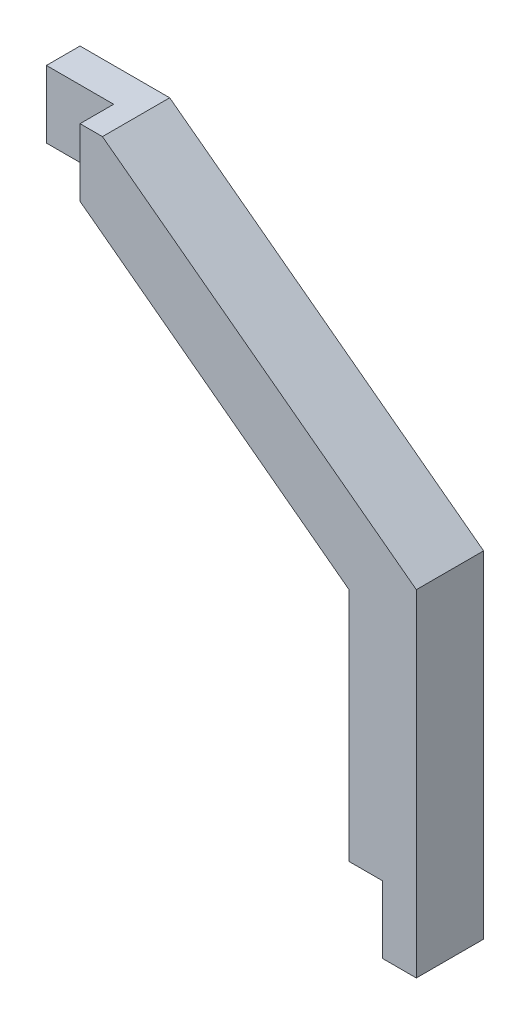
ISO-10303-21;
HEADER;
FILE_DESCRIPTION(('STEP AP214'),'2;1');
FILE_NAME('part.step','',(''),(''),'','','');
FILE_SCHEMA(('AUTOMOTIVE_DESIGN { 1 0 10303 214 1 1 1 1 }'));
ENDSEC;
DATA;
#1=APPLICATION_CONTEXT('core data for automotive mechanical design processes');
#2=APPLICATION_PROTOCOL_DEFINITION('international standard','automotive_design',2000,#1);
#3=PRODUCT_CONTEXT('',#1,'mechanical');
#4=PRODUCT('Part','Part','',(#3));
#5=PRODUCT_RELATED_PRODUCT_CATEGORY('part','',(#4));
#6=PRODUCT_DEFINITION_FORMATION('','',#4);
#7=PRODUCT_DEFINITION_CONTEXT('part definition',#1,'design');
#8=PRODUCT_DEFINITION('design','',#6,#7);
#9=PRODUCT_DEFINITION_SHAPE('','',#8);
#10=(LENGTH_UNIT() NAMED_UNIT(*) SI_UNIT(.MILLI.,.METRE.));
#11=(NAMED_UNIT(*) PLANE_ANGLE_UNIT() SI_UNIT($,.RADIAN.));
#12=(NAMED_UNIT(*) SI_UNIT($,.STERADIAN.) SOLID_ANGLE_UNIT());
#13=UNCERTAINTY_MEASURE_WITH_UNIT(LENGTH_MEASURE(1.E-05),#10,'distance_accuracy_value','');
#14=(GEOMETRIC_REPRESENTATION_CONTEXT(3) GLOBAL_UNCERTAINTY_ASSIGNED_CONTEXT((#13)) GLOBAL_UNIT_ASSIGNED_CONTEXT((#10,
#11,#12)) REPRESENTATION_CONTEXT('',''));
#15=CARTESIAN_POINT('',(0.,0.,0.));
#16=DIRECTION('',(0.,0.,1.));
#17=DIRECTION('',(1.,0.,0.));
#18=AXIS2_PLACEMENT_3D('',#15,#16,#17);
#19=CARTESIAN_POINT('',(40.,-170.,20.));
#20=DIRECTION('',(-1.,0.,0.));
#21=DIRECTION('',(0.,-1.,0.));
#22=AXIS2_PLACEMENT_3D('',#19,#20,#21);
#23=PLANE('',#22);
#24=DIRECTION('',(0.,1.,0.));
#25=VECTOR('',#24,1.);
#26=CARTESIAN_POINT('',(40.,-170.,0.));
#27=LINE('',#26,#25);
#28=CARTESIAN_POINT('',(40.,-150.,0.));
#29=VERTEX_POINT('',#28);
#30=CARTESIAN_POINT('',(40.,-80.,0.));
#31=VERTEX_POINT('',#30);
#32=EDGE_CURVE('E162',#29,#31,#27,.T.);
#33=ORIENTED_EDGE('',*,*,#32,.F.);
#34=DIRECTION('',(0.,0.,1.));
#35=VECTOR('',#34,1.);
#36=CARTESIAN_POINT('',(40.,-150.,0.));
#37=LINE('',#36,#35);
#38=CARTESIAN_POINT('',(40.,-150.,20.));
#39=VERTEX_POINT('',#38);
#40=EDGE_CURVE('E222',#29,#39,#37,.T.);
#41=ORIENTED_EDGE('',*,*,#40,.T.);
#42=DIRECTION('',(0.,1.,0.));
#43=VECTOR('',#42,1.);
#44=CARTESIAN_POINT('',(40.,-170.,20.));
#45=LINE('',#44,#43);
#46=CARTESIAN_POINT('',(40.,-80.,20.));
#47=VERTEX_POINT('',#46);
#48=EDGE_CURVE('E137',#39,#47,#45,.T.);
#49=ORIENTED_EDGE('',*,*,#48,.T.);
#50=DIRECTION('',(0.,0.,-1.));
#51=VECTOR('',#50,1.);
#52=CARTESIAN_POINT('',(40.,-80.,20.));
#53=LINE('',#52,#51);
#54=EDGE_CURVE('E125',#47,#31,#53,.T.);
#55=ORIENTED_EDGE('',*,*,#54,.T.);
#56=EDGE_LOOP('',(#33,#41,#49,#55));
#57=FACE_BOUND('',#56,.T.);
#58=ADVANCED_FACE('F39',(#57),#23,.T.);
#59=CARTESIAN_POINT('',(0.,0.,20.));
#60=DIRECTION('',(0.,0.,-1.));
#61=DIRECTION('',(-1.,0.,0.));
#62=AXIS2_PLACEMENT_3D('',#59,#60,#61);
#63=PLANE('',#62);
#64=DIRECTION('',(-1.,0.,0.));
#65=VECTOR('',#64,1.);
#66=CARTESIAN_POINT('',(50.,-150.,20.));
#67=LINE('',#66,#65);
#68=CARTESIAN_POINT('',(50.,-150.,20.));
#69=VERTEX_POINT('',#68);
#70=EDGE_CURVE('E208',#69,#39,#67,.T.);
#71=ORIENTED_EDGE('',*,*,#70,.F.);
#72=DIRECTION('',(0.,-1.,0.));
#73=VECTOR('',#72,1.);
#74=CARTESIAN_POINT('',(50.,-150.,20.));
#75=LINE('',#74,#73);
#76=CARTESIAN_POINT('',(50.,-170.,20.));
#77=VERTEX_POINT('',#76);
#78=EDGE_CURVE('E136',#69,#77,#75,.T.);
#79=ORIENTED_EDGE('',*,*,#78,.T.);
#80=DIRECTION('',(-1.,0.,0.));
#81=VECTOR('',#80,1.);
#82=CARTESIAN_POINT('',(60.,-170.,20.));
#83=LINE('',#82,#81);
#84=CARTESIAN_POINT('',(60.,-170.,20.));
#85=VERTEX_POINT('',#84);
#86=EDGE_CURVE('E118',#85,#77,#83,.T.);
#87=ORIENTED_EDGE('',*,*,#86,.F.);
#88=DIRECTION('',(0.,-1.,0.));
#89=VECTOR('',#88,1.);
#90=CARTESIAN_POINT('',(60.,-69.9999999999999,20.));
#91=LINE('',#90,#89);
#92=CARTESIAN_POINT('',(60.,-69.9999999999999,20.));
#93=VERTEX_POINT('',#92);
#94=EDGE_CURVE('E134',#93,#85,#91,.T.);
#95=ORIENTED_EDGE('',*,*,#94,.F.);
#96=DIRECTION('',(0.8,-0.6,0.));
#97=VECTOR('',#96,1.);
#98=CARTESIAN_POINT('',(-33.3333333333333,0.,20.));
#99=LINE('',#98,#97);
#100=CARTESIAN_POINT('',(-33.3333333333333,0.,20.));
#101=VERTEX_POINT('',#100);
#102=EDGE_CURVE('E140',#101,#93,#99,.T.);
#103=ORIENTED_EDGE('',*,*,#102,.F.);
#104=DIRECTION('',(1.,0.,0.));
#105=VECTOR('',#104,1.);
#106=CARTESIAN_POINT('',(-60.,0.,20.));
#107=LINE('',#106,#105);
#108=CARTESIAN_POINT('',(-40.,0.,20.));
#109=VERTEX_POINT('',#108);
#110=EDGE_CURVE('E102',#109,#101,#107,.T.);
#111=ORIENTED_EDGE('',*,*,#110,.F.);
#112=DIRECTION('',(0.,1.,0.));
#113=VECTOR('',#112,1.);
#114=CARTESIAN_POINT('',(-40.,-20.,20.));
#115=LINE('',#114,#113);
#116=CARTESIAN_POINT('',(-40.,-20.,20.));
#117=VERTEX_POINT('',#116);
#118=EDGE_CURVE('E202',#117,#109,#115,.T.);
#119=ORIENTED_EDGE('',*,*,#118,.F.);
#120=DIRECTION('',(-0.8,0.6,0.));
#121=VECTOR('',#120,1.);
#122=CARTESIAN_POINT('',(40.,-80.,20.));
#123=LINE('',#122,#121);
#124=EDGE_CURVE('E146',#47,#117,#123,.T.);
#125=ORIENTED_EDGE('',*,*,#124,.F.);
#126=ORIENTED_EDGE('',*,*,#48,.F.);
#127=EDGE_LOOP('',(#71,#79,#87,#95,#103,#111,#119,#125,#126));
#128=FACE_BOUND('',#127,.T.);
#129=ADVANCED_FACE('F132',(#128),#63,.F.);
#130=CARTESIAN_POINT('',(0.,0.,0.));
#131=DIRECTION('',(0.,0.,-1.));
#132=DIRECTION('',(-1.,0.,0.));
#133=AXIS2_PLACEMENT_3D('',#130,#131,#132);
#134=PLANE('',#133);
#135=DIRECTION('',(0.,1.,0.));
#136=VECTOR('',#135,1.);
#137=CARTESIAN_POINT('',(50.,-170.,0.));
#138=LINE('',#137,#136);
#139=CARTESIAN_POINT('',(50.,-170.,0.));
#140=VERTEX_POINT('',#139);
#141=CARTESIAN_POINT('',(50.,-150.,0.));
#142=VERTEX_POINT('',#141);
#143=EDGE_CURVE('E226',#140,#142,#138,.T.);
#144=ORIENTED_EDGE('',*,*,#143,.T.);
#145=DIRECTION('',(-1.,0.,0.));
#146=VECTOR('',#145,1.);
#147=CARTESIAN_POINT('',(50.,-150.,0.));
#148=LINE('',#147,#146);
#149=EDGE_CURVE('E204',#142,#29,#148,.T.);
#150=ORIENTED_EDGE('',*,*,#149,.T.);
#151=ORIENTED_EDGE('',*,*,#32,.T.);
#152=DIRECTION('',(-0.8,0.6,0.));
#153=VECTOR('',#152,1.);
#154=CARTESIAN_POINT('',(40.,-80.,0.));
#155=LINE('',#154,#153);
#156=CARTESIAN_POINT('',(-40.,-20.,0.));
#157=VERTEX_POINT('',#156);
#158=EDGE_CURVE('E164',#31,#157,#155,.T.);
#159=ORIENTED_EDGE('',*,*,#158,.T.);
#160=DIRECTION('',(-1.,0.,0.));
#161=VECTOR('',#160,1.);
#162=CARTESIAN_POINT('',(-40.,-20.,0.));
#163=LINE('',#162,#161);
#164=CARTESIAN_POINT('',(-60.,-20.,0.));
#165=VERTEX_POINT('',#164);
#166=EDGE_CURVE('E167',#157,#165,#163,.T.);
#167=ORIENTED_EDGE('',*,*,#166,.T.);
#168=DIRECTION('',(0.,1.,0.));
#169=VECTOR('',#168,1.);
#170=CARTESIAN_POINT('',(-60.,-20.,0.));
#171=LINE('',#170,#169);
#172=CARTESIAN_POINT('',(-60.,0.,0.));
#173=VERTEX_POINT('',#172);
#174=EDGE_CURVE('E149',#165,#173,#171,.T.);
#175=ORIENTED_EDGE('',*,*,#174,.T.);
#176=DIRECTION('',(1.,0.,0.));
#177=VECTOR('',#176,1.);
#178=CARTESIAN_POINT('',(-60.,0.,0.));
#179=LINE('',#178,#177);
#180=CARTESIAN_POINT('',(-33.3333333333333,0.,0.));
#181=VERTEX_POINT('',#180);
#182=EDGE_CURVE('E152',#173,#181,#179,.T.);
#183=ORIENTED_EDGE('',*,*,#182,.T.);
#184=DIRECTION('',(0.8,-0.6,0.));
#185=VECTOR('',#184,1.);
#186=CARTESIAN_POINT('',(-33.3333333333333,0.,0.));
#187=LINE('',#186,#185);
#188=CARTESIAN_POINT('',(60.,-69.9999999999999,0.));
#189=VERTEX_POINT('',#188);
#190=EDGE_CURVE('E156',#181,#189,#187,.T.);
#191=ORIENTED_EDGE('',*,*,#190,.T.);
#192=DIRECTION('',(0.,-1.,0.));
#193=VECTOR('',#192,1.);
#194=CARTESIAN_POINT('',(60.,-69.9999999999999,0.));
#195=LINE('',#194,#193);
#196=CARTESIAN_POINT('',(60.,-170.,0.));
#197=VERTEX_POINT('',#196);
#198=EDGE_CURVE('E159',#189,#197,#195,.T.);
#199=ORIENTED_EDGE('',*,*,#198,.T.);
#200=DIRECTION('',(-1.,0.,0.));
#201=VECTOR('',#200,1.);
#202=CARTESIAN_POINT('',(60.,-170.,0.));
#203=LINE('',#202,#201);
#204=EDGE_CURVE('E120',#197,#140,#203,.T.);
#205=ORIENTED_EDGE('',*,*,#204,.T.);
#206=EDGE_LOOP('',(#144,#150,#151,#159,#167,#175,#183,#191,#199,#205));
#207=FACE_BOUND('',#206,.T.);
#208=ADVANCED_FACE('F186',(#207),#134,.T.);
#209=CARTESIAN_POINT('',(-60.,-20.,20.));
#210=DIRECTION('',(-1.,0.,0.));
#211=DIRECTION('',(0.,0.,1.));
#212=AXIS2_PLACEMENT_3D('',#209,#210,#211);
#213=PLANE('',#212);
#214=DIRECTION('',(0.,0.,-1.));
#215=VECTOR('',#214,1.);
#216=CARTESIAN_POINT('',(-60.,-20.,20.));
#217=LINE('',#216,#215);
#218=CARTESIAN_POINT('',(-60.,-20.,10.));
#219=VERTEX_POINT('',#218);
#220=EDGE_CURVE('E11',#219,#165,#217,.T.);
#221=ORIENTED_EDGE('',*,*,#220,.F.);
#222=DIRECTION('',(0.,-1.,0.));
#223=VECTOR('',#222,1.);
#224=CARTESIAN_POINT('',(-60.,0.,10.));
#225=LINE('',#224,#223);
#226=CARTESIAN_POINT('',(-60.,0.,10.));
#227=VERTEX_POINT('',#226);
#228=EDGE_CURVE('E181',#227,#219,#225,.T.);
#229=ORIENTED_EDGE('',*,*,#228,.F.);
#230=DIRECTION('',(0.,0.,-1.));
#231=VECTOR('',#230,1.);
#232=CARTESIAN_POINT('',(-60.,0.,20.));
#233=LINE('',#232,#231);
#234=EDGE_CURVE('E43',#227,#173,#233,.T.);
#235=ORIENTED_EDGE('',*,*,#234,.T.);
#236=ORIENTED_EDGE('',*,*,#174,.F.);
#237=EDGE_LOOP('',(#221,#229,#235,#236));
#238=FACE_BOUND('',#237,.T.);
#239=ADVANCED_FACE('F41',(#238),#213,.T.);
#240=CARTESIAN_POINT('',(-40.,-20.,20.));
#241=DIRECTION('',(0.,-1.,0.));
#242=DIRECTION('',(1.,0.,0.));
#243=AXIS2_PLACEMENT_3D('',#240,#241,#242);
#244=PLANE('',#243);
#245=DIRECTION('',(0.,0.,-1.));
#246=VECTOR('',#245,1.);
#247=CARTESIAN_POINT('',(-40.,-20.,20.));
#248=LINE('',#247,#246);
#249=CARTESIAN_POINT('',(-40.,-20.,10.));
#250=VERTEX_POINT('',#249);
#251=EDGE_CURVE('E171',#250,#157,#248,.T.);
#252=ORIENTED_EDGE('',*,*,#251,.F.);
#253=DIRECTION('',(1.,0.,0.));
#254=VECTOR('',#253,1.);
#255=CARTESIAN_POINT('',(-60.,-20.,10.));
#256=LINE('',#255,#254);
#257=EDGE_CURVE('E193',#219,#250,#256,.T.);
#258=ORIENTED_EDGE('',*,*,#257,.F.);
#259=ORIENTED_EDGE('',*,*,#220,.T.);
#260=ORIENTED_EDGE('',*,*,#166,.F.);
#261=EDGE_LOOP('',(#252,#258,#259,#260));
#262=FACE_BOUND('',#261,.T.);
#263=ADVANCED_FACE('F189',(#262),#244,.T.);
#264=CARTESIAN_POINT('',(40.,-80.,20.));
#265=DIRECTION('',(-0.6,-0.8,0.));
#266=DIRECTION('',(0.8,-0.6,0.));
#267=AXIS2_PLACEMENT_3D('',#264,#265,#266);
#268=PLANE('',#267);
#269=ORIENTED_EDGE('',*,*,#158,.F.);
#270=ORIENTED_EDGE('',*,*,#54,.F.);
#271=ORIENTED_EDGE('',*,*,#124,.T.);
#272=EDGE_CURVE('E48',#117,#250,#248,.T.);
#273=ORIENTED_EDGE('',*,*,#272,.T.);
#274=ORIENTED_EDGE('',*,*,#251,.T.);
#275=EDGE_LOOP('',(#269,#270,#271,#273,#274));
#276=FACE_BOUND('',#275,.T.);
#277=ADVANCED_FACE('F197',(#276),#268,.T.);
#278=CARTESIAN_POINT('',(60.,-170.,20.));
#279=DIRECTION('',(0.,-1.,0.));
#280=DIRECTION('',(0.,0.,-1.));
#281=AXIS2_PLACEMENT_3D('',#278,#279,#280);
#282=PLANE('',#281);
#283=DIRECTION('',(0.,0.,-1.));
#284=VECTOR('',#283,1.);
#285=CARTESIAN_POINT('',(50.,-170.,20.));
#286=LINE('',#285,#284);
#287=EDGE_CURVE('E228',#77,#140,#286,.T.);
#288=ORIENTED_EDGE('',*,*,#287,.T.);
#289=ORIENTED_EDGE('',*,*,#204,.F.);
#290=DIRECTION('',(0.,0.,-1.));
#291=VECTOR('',#290,1.);
#292=CARTESIAN_POINT('',(60.,-170.,20.));
#293=LINE('',#292,#291);
#294=EDGE_CURVE('E113',#85,#197,#293,.T.);
#295=ORIENTED_EDGE('',*,*,#294,.F.);
#296=ORIENTED_EDGE('',*,*,#86,.T.);
#297=EDGE_LOOP('',(#288,#289,#295,#296));
#298=FACE_BOUND('',#297,.T.);
#299=ADVANCED_FACE('F116',(#298),#282,.T.);
#300=CARTESIAN_POINT('',(60.,-69.9999999999999,20.));
#301=DIRECTION('',(1.,0.,0.));
#302=DIRECTION('',(0.,1.,0.));
#303=AXIS2_PLACEMENT_3D('',#300,#301,#302);
#304=PLANE('',#303);
#305=ORIENTED_EDGE('',*,*,#198,.F.);
#306=DIRECTION('',(0.,0.,-1.));
#307=VECTOR('',#306,1.);
#308=CARTESIAN_POINT('',(60.,-69.9999999999999,20.));
#309=LINE('',#308,#307);
#310=EDGE_CURVE('E126',#93,#189,#309,.T.);
#311=ORIENTED_EDGE('',*,*,#310,.F.);
#312=ORIENTED_EDGE('',*,*,#94,.T.);
#313=ORIENTED_EDGE('',*,*,#294,.T.);
#314=EDGE_LOOP('',(#305,#311,#312,#313));
#315=FACE_BOUND('',#314,.T.);
#316=ADVANCED_FACE('F139',(#315),#304,.T.);
#317=CARTESIAN_POINT('',(-33.3333333333333,0.,20.));
#318=DIRECTION('',(0.6,0.8,0.));
#319=DIRECTION('',(-0.8,0.6,0.));
#320=AXIS2_PLACEMENT_3D('',#317,#318,#319);
#321=PLANE('',#320);
#322=ORIENTED_EDGE('',*,*,#190,.F.);
#323=DIRECTION('',(0.,0.,-1.));
#324=VECTOR('',#323,1.);
#325=CARTESIAN_POINT('',(-33.3333333333333,0.,20.));
#326=LINE('',#325,#324);
#327=EDGE_CURVE('E174',#101,#181,#326,.T.);
#328=ORIENTED_EDGE('',*,*,#327,.F.);
#329=ORIENTED_EDGE('',*,*,#102,.T.);
#330=ORIENTED_EDGE('',*,*,#310,.T.);
#331=EDGE_LOOP('',(#322,#328,#329,#330));
#332=FACE_BOUND('',#331,.T.);
#333=ADVANCED_FACE('F235',(#332),#321,.T.);
#334=CARTESIAN_POINT('',(-60.,0.,20.));
#335=DIRECTION('',(0.,1.,0.));
#336=DIRECTION('',(-1.,0.,0.));
#337=AXIS2_PLACEMENT_3D('',#334,#335,#336);
#338=PLANE('',#337);
#339=DIRECTION('',(0.,0.,1.));
#340=VECTOR('',#339,1.);
#341=CARTESIAN_POINT('',(-40.,0.,10.));
#342=LINE('',#341,#340);
#343=CARTESIAN_POINT('',(-40.,0.,10.));
#344=VERTEX_POINT('',#343);
#345=EDGE_CURVE('E153',#344,#109,#342,.T.);
#346=ORIENTED_EDGE('',*,*,#345,.T.);
#347=ORIENTED_EDGE('',*,*,#110,.T.);
#348=ORIENTED_EDGE('',*,*,#327,.T.);
#349=ORIENTED_EDGE('',*,*,#182,.F.);
#350=ORIENTED_EDGE('',*,*,#234,.F.);
#351=DIRECTION('',(-1.,0.,0.));
#352=VECTOR('',#351,1.);
#353=CARTESIAN_POINT('',(-40.,0.,10.));
#354=LINE('',#353,#352);
#355=EDGE_CURVE('E212',#344,#227,#354,.T.);
#356=ORIENTED_EDGE('',*,*,#355,.F.);
#357=EDGE_LOOP('',(#346,#347,#348,#349,#350,#356));
#358=FACE_BOUND('',#357,.T.);
#359=ADVANCED_FACE('F183',(#358),#338,.T.);
#360=CARTESIAN_POINT('',(-40.,-20.,10.));
#361=DIRECTION('',(1.,0.,0.));
#362=DIRECTION('',(0.,0.,-1.));
#363=AXIS2_PLACEMENT_3D('',#360,#361,#362);
#364=PLANE('',#363);
#365=ORIENTED_EDGE('',*,*,#118,.T.);
#366=ORIENTED_EDGE('',*,*,#345,.F.);
#367=DIRECTION('',(0.,1.,0.));
#368=VECTOR('',#367,1.);
#369=CARTESIAN_POINT('',(-40.,-20.,10.));
#370=LINE('',#369,#368);
#371=EDGE_CURVE('E215',#250,#344,#370,.T.);
#372=ORIENTED_EDGE('',*,*,#371,.F.);
#373=ORIENTED_EDGE('',*,*,#272,.F.);
#374=EDGE_LOOP('',(#365,#366,#372,#373));
#375=FACE_BOUND('',#374,.T.);
#376=ADVANCED_FACE('F243',(#375),#364,.F.);
#377=CARTESIAN_POINT('',(0.,0.,10.));
#378=DIRECTION('',(0.,0.,1.));
#379=DIRECTION('',(1.,0.,0.));
#380=AXIS2_PLACEMENT_3D('',#377,#378,#379);
#381=PLANE('',#380);
#382=ORIENTED_EDGE('',*,*,#228,.T.);
#383=ORIENTED_EDGE('',*,*,#257,.T.);
#384=ORIENTED_EDGE('',*,*,#371,.T.);
#385=ORIENTED_EDGE('',*,*,#355,.T.);
#386=EDGE_LOOP('',(#382,#383,#384,#385));
#387=FACE_BOUND('',#386,.T.);
#388=ADVANCED_FACE('F272',(#387),#381,.T.);
#389=CARTESIAN_POINT('',(50.,-150.,0.));
#390=DIRECTION('',(0.,-1.,0.));
#391=DIRECTION('',(1.,0.,0.));
#392=AXIS2_PLACEMENT_3D('',#389,#390,#391);
#393=PLANE('',#392);
#394=ORIENTED_EDGE('',*,*,#40,.F.);
#395=ORIENTED_EDGE('',*,*,#149,.F.);
#396=DIRECTION('',(0.,0.,1.));
#397=VECTOR('',#396,1.);
#398=CARTESIAN_POINT('',(50.,-150.,0.));
#399=LINE('',#398,#397);
#400=EDGE_CURVE('E56',#142,#69,#399,.T.);
#401=ORIENTED_EDGE('',*,*,#400,.T.);
#402=ORIENTED_EDGE('',*,*,#70,.T.);
#403=EDGE_LOOP('',(#394,#395,#401,#402));
#404=FACE_BOUND('',#403,.T.);
#405=ADVANCED_FACE('F274',(#404),#393,.T.);
#406=CARTESIAN_POINT('',(50.,0.,0.));
#407=DIRECTION('',(1.,0.,0.));
#408=DIRECTION('',(0.,1.,0.));
#409=AXIS2_PLACEMENT_3D('',#406,#407,#408);
#410=PLANE('',#409);
#411=ORIENTED_EDGE('',*,*,#78,.F.);
#412=ORIENTED_EDGE('',*,*,#400,.F.);
#413=ORIENTED_EDGE('',*,*,#143,.F.);
#414=ORIENTED_EDGE('',*,*,#287,.F.);
#415=EDGE_LOOP('',(#411,#412,#413,#414));
#416=FACE_BOUND('',#415,.T.);
#417=ADVANCED_FACE('F276',(#416),#410,.F.);
#418=CLOSED_SHELL('',(#58,#129,#208,#239,#263,#277,#299,#316,#333,#359,#376,#388,#405,#417));
#419=MANIFOLD_SOLID_BREP('B2',#418);
#420=ADVANCED_BREP_SHAPE_REPRESENTATION('',(#18,#419),#14);
#421=SHAPE_DEFINITION_REPRESENTATION(#9,#420);
ENDSEC;
END-ISO-10303-21;
